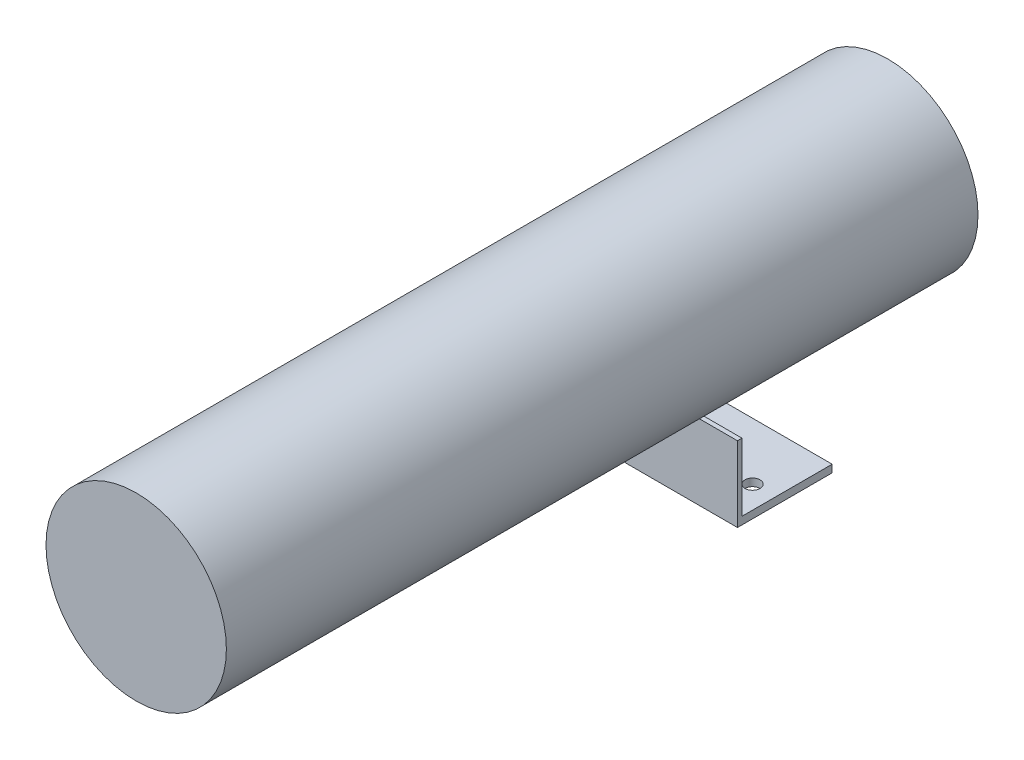
ISO-10303-21;
HEADER;
FILE_DESCRIPTION(('STEP AP214'),'2;1');
FILE_NAME('part.step','',(''),(''),'','','');
FILE_SCHEMA(('AUTOMOTIVE_DESIGN { 1 0 10303 214 1 1 1 1 }'));
ENDSEC;
DATA;
#1=APPLICATION_CONTEXT('core data for automotive mechanical design processes');
#2=APPLICATION_PROTOCOL_DEFINITION('international standard','automotive_design',2000,#1);
#3=PRODUCT_CONTEXT('',#1,'mechanical');
#4=PRODUCT('Part','Part','',(#3));
#5=PRODUCT_RELATED_PRODUCT_CATEGORY('part','',(#4));
#6=PRODUCT_DEFINITION_FORMATION('','',#4);
#7=PRODUCT_DEFINITION_CONTEXT('part definition',#1,'design');
#8=PRODUCT_DEFINITION('design','',#6,#7);
#9=PRODUCT_DEFINITION_SHAPE('','',#8);
#10=(LENGTH_UNIT() NAMED_UNIT(*) SI_UNIT(.MILLI.,.METRE.));
#11=(NAMED_UNIT(*) PLANE_ANGLE_UNIT() SI_UNIT($,.RADIAN.));
#12=(NAMED_UNIT(*) SI_UNIT($,.STERADIAN.) SOLID_ANGLE_UNIT());
#13=UNCERTAINTY_MEASURE_WITH_UNIT(LENGTH_MEASURE(1.E-05),#10,'distance_accuracy_value','');
#14=(GEOMETRIC_REPRESENTATION_CONTEXT(3) GLOBAL_UNCERTAINTY_ASSIGNED_CONTEXT((#13)) GLOBAL_UNIT_ASSIGNED_CONTEXT((#10,
#11,#12)) REPRESENTATION_CONTEXT('',''));
#15=CARTESIAN_POINT('',(0.,0.,0.));
#16=DIRECTION('',(0.,0.,1.));
#17=DIRECTION('',(1.,0.,0.));
#18=AXIS2_PLACEMENT_3D('',#15,#16,#17);
#19=CARTESIAN_POINT('',(63.5,-76.2,186.69));
#20=DIRECTION('',(-1.,0.,0.));
#21=DIRECTION('',(0.,0.,1.));
#22=AXIS2_PLACEMENT_3D('',#19,#20,#21);
#23=PLANE('',#22);
#24=DIRECTION('',(0.,-1.,0.));
#25=VECTOR('',#24,1.);
#26=CARTESIAN_POINT('',(63.5,-76.2,190.5));
#27=LINE('',#26,#25);
#28=CARTESIAN_POINT('',(63.5,-76.2,190.5));
#29=VERTEX_POINT('',#28);
#30=CARTESIAN_POINT('',(63.5,-139.7,190.5));
#31=VERTEX_POINT('',#30);
#32=EDGE_CURVE('E101',#29,#31,#27,.T.);
#33=ORIENTED_EDGE('',*,*,#32,.T.);
#34=DIRECTION('',(0.,0.,1.));
#35=VECTOR('',#34,1.);
#36=CARTESIAN_POINT('',(63.5,-139.7,186.69));
#37=LINE('',#36,#35);
#38=CARTESIAN_POINT('',(63.5,-139.7,110.49));
#39=VERTEX_POINT('',#38);
#40=EDGE_CURVE('E12',#39,#31,#37,.T.);
#41=ORIENTED_EDGE('',*,*,#40,.F.);
#42=DIRECTION('',(0.,-1.,0.));
#43=VECTOR('',#42,1.);
#44=CARTESIAN_POINT('',(63.5,-133.35,110.49));
#45=LINE('',#44,#43);
#46=CARTESIAN_POINT('',(63.5,-133.35,110.49));
#47=VERTEX_POINT('',#46);
#48=EDGE_CURVE('E130',#47,#39,#45,.T.);
#49=ORIENTED_EDGE('',*,*,#48,.F.);
#50=DIRECTION('',(0.,0.,1.));
#51=VECTOR('',#50,1.);
#52=CARTESIAN_POINT('',(63.5,-133.35,110.49));
#53=LINE('',#52,#51);
#54=CARTESIAN_POINT('',(63.5,-133.35,186.69));
#55=VERTEX_POINT('',#54);
#56=EDGE_CURVE('E110',#47,#55,#53,.T.);
#57=ORIENTED_EDGE('',*,*,#56,.T.);
#58=DIRECTION('',(0.,-1.,0.));
#59=VECTOR('',#58,1.);
#60=CARTESIAN_POINT('',(63.5,-76.2,186.69));
#61=LINE('',#60,#59);
#62=CARTESIAN_POINT('',(63.5,-76.2,186.69));
#63=VERTEX_POINT('',#62);
#64=EDGE_CURVE('E95',#63,#55,#61,.T.);
#65=ORIENTED_EDGE('',*,*,#64,.F.);
#66=DIRECTION('',(0.,0.,1.));
#67=VECTOR('',#66,1.);
#68=CARTESIAN_POINT('',(63.5,-76.2,186.69));
#69=LINE('',#68,#67);
#70=EDGE_CURVE('E88',#63,#29,#69,.T.);
#71=ORIENTED_EDGE('',*,*,#70,.T.);
#72=EDGE_LOOP('',(#33,#41,#49,#57,#65,#71));
#73=FACE_BOUND('',#72,.T.);
#74=ADVANCED_FACE('F44',(#73),#23,.F.);
#75=CARTESIAN_POINT('',(63.5,-139.7,186.69));
#76=DIRECTION('',(0.,1.,0.));
#77=DIRECTION('',(0.,0.,1.));
#78=AXIS2_PLACEMENT_3D('',#75,#76,#77);
#79=PLANE('',#78);
#80=CARTESIAN_POINT('',(-44.45,-139.7,158.75));
#81=DIRECTION('',(0.,1.,0.));
#82=DIRECTION('',(0.,0.,1.));
#83=AXIS2_PLACEMENT_3D('',#80,#81,#82);
#84=CIRCLE('',#83,6.35);
#85=CARTESIAN_POINT('',(-44.45,-139.7,165.1));
#86=VERTEX_POINT('',#85);
#87=EDGE_CURVE('E154',#86,#86,#84,.T.);
#88=ORIENTED_EDGE('',*,*,#87,.T.);
#89=EDGE_LOOP('',(#88));
#90=FACE_BOUND('',#89,.T.);
#91=CARTESIAN_POINT('',(44.45,-139.7,158.75));
#92=DIRECTION('',(0.,1.,0.));
#93=DIRECTION('',(0.,0.,1.));
#94=AXIS2_PLACEMENT_3D('',#91,#92,#93);
#95=CIRCLE('',#94,6.35);
#96=CARTESIAN_POINT('',(44.45,-139.7,165.1));
#97=VERTEX_POINT('',#96);
#98=EDGE_CURVE('E131',#97,#97,#95,.T.);
#99=ORIENTED_EDGE('',*,*,#98,.T.);
#100=EDGE_LOOP('',(#99));
#101=FACE_BOUND('',#100,.T.);
#102=DIRECTION('',(-1.,0.,0.));
#103=VECTOR('',#102,1.);
#104=CARTESIAN_POINT('',(63.5,-139.7,190.5));
#105=LINE('',#104,#103);
#106=CARTESIAN_POINT('',(-63.5,-139.7,190.5));
#107=VERTEX_POINT('',#106);
#108=EDGE_CURVE('E105',#31,#107,#105,.T.);
#109=ORIENTED_EDGE('',*,*,#108,.T.);
#110=DIRECTION('',(0.,0.,1.));
#111=VECTOR('',#110,1.);
#112=CARTESIAN_POINT('',(-63.5,-139.7,186.69));
#113=LINE('',#112,#111);
#114=CARTESIAN_POINT('',(-63.5,-139.7,110.49));
#115=VERTEX_POINT('',#114);
#116=EDGE_CURVE('E52',#115,#107,#113,.T.);
#117=ORIENTED_EDGE('',*,*,#116,.F.);
#118=DIRECTION('',(-1.,0.,0.));
#119=VECTOR('',#118,1.);
#120=CARTESIAN_POINT('',(63.5,-139.7,110.49));
#121=LINE('',#120,#119);
#122=EDGE_CURVE('E143',#39,#115,#121,.T.);
#123=ORIENTED_EDGE('',*,*,#122,.F.);
#124=ORIENTED_EDGE('',*,*,#40,.T.);
#125=EDGE_LOOP('',(#109,#117,#123,#124));
#126=FACE_BOUND('',#125,.T.);
#127=ADVANCED_FACE('F163',(#90,#101,#126),#79,.F.);
#128=CARTESIAN_POINT('',(-63.5,-139.7,186.69));
#129=DIRECTION('',(1.,0.,0.));
#130=DIRECTION('',(0.,0.,-1.));
#131=AXIS2_PLACEMENT_3D('',#128,#129,#130);
#132=PLANE('',#131);
#133=DIRECTION('',(0.,1.,0.));
#134=VECTOR('',#133,1.);
#135=CARTESIAN_POINT('',(-63.5,-139.7,190.5));
#136=LINE('',#135,#134);
#137=CARTESIAN_POINT('',(-63.5,-76.2,190.5));
#138=VERTEX_POINT('',#137);
#139=EDGE_CURVE('E96',#107,#138,#136,.T.);
#140=ORIENTED_EDGE('',*,*,#139,.T.);
#141=DIRECTION('',(0.,0.,1.));
#142=VECTOR('',#141,1.);
#143=CARTESIAN_POINT('',(-63.5,-76.2,186.69));
#144=LINE('',#143,#142);
#145=CARTESIAN_POINT('',(-63.5,-76.2,186.69));
#146=VERTEX_POINT('',#145);
#147=EDGE_CURVE('E91',#146,#138,#144,.T.);
#148=ORIENTED_EDGE('',*,*,#147,.F.);
#149=DIRECTION('',(0.,1.,0.));
#150=VECTOR('',#149,1.);
#151=CARTESIAN_POINT('',(-63.5,-139.7,186.69));
#152=LINE('',#151,#150);
#153=CARTESIAN_POINT('',(-63.5,-133.35,186.69));
#154=VERTEX_POINT('',#153);
#155=EDGE_CURVE('E120',#154,#146,#152,.T.);
#156=ORIENTED_EDGE('',*,*,#155,.F.);
#157=DIRECTION('',(0.,0.,1.));
#158=VECTOR('',#157,1.);
#159=CARTESIAN_POINT('',(-63.5,-133.35,110.49));
#160=LINE('',#159,#158);
#161=CARTESIAN_POINT('',(-63.5,-133.35,110.49));
#162=VERTEX_POINT('',#161);
#163=EDGE_CURVE('E106',#162,#154,#160,.T.);
#164=ORIENTED_EDGE('',*,*,#163,.F.);
#165=DIRECTION('',(0.,1.,0.));
#166=VECTOR('',#165,1.);
#167=CARTESIAN_POINT('',(-63.5,-133.35,110.49));
#168=LINE('',#167,#166);
#169=EDGE_CURVE('E138',#115,#162,#168,.T.);
#170=ORIENTED_EDGE('',*,*,#169,.F.);
#171=ORIENTED_EDGE('',*,*,#116,.T.);
#172=EDGE_LOOP('',(#140,#148,#156,#164,#170,#171));
#173=FACE_BOUND('',#172,.T.);
#174=ADVANCED_FACE('F190',(#173),#132,.F.);
#175=CARTESIAN_POINT('',(63.5,-76.2,186.69));
#176=DIRECTION('',(0.,-1.,0.));
#177=DIRECTION('',(0.,0.,-1.));
#178=AXIS2_PLACEMENT_3D('',#175,#176,#177);
#179=PLANE('',#178);
#180=DIRECTION('',(1.,0.,0.));
#181=VECTOR('',#180,1.);
#182=CARTESIAN_POINT('',(63.5,-76.2,190.5));
#183=LINE('',#182,#181);
#184=EDGE_CURVE('E85',#138,#29,#183,.T.);
#185=ORIENTED_EDGE('',*,*,#184,.T.);
#186=ORIENTED_EDGE('',*,*,#70,.F.);
#187=DIRECTION('',(1.,0.,0.));
#188=VECTOR('',#187,1.);
#189=CARTESIAN_POINT('',(63.5,-76.2,186.69));
#190=LINE('',#189,#188);
#191=EDGE_CURVE('E66',#146,#63,#190,.T.);
#192=ORIENTED_EDGE('',*,*,#191,.F.);
#193=ORIENTED_EDGE('',*,*,#147,.T.);
#194=EDGE_LOOP('',(#185,#186,#192,#193));
#195=FACE_BOUND('',#194,.T.);
#196=ADVANCED_FACE('F87',(#195),#179,.F.);
#197=CARTESIAN_POINT('',(0.,0.,186.69));
#198=DIRECTION('',(0.,0.,-1.));
#199=DIRECTION('',(-1.,0.,0.));
#200=AXIS2_PLACEMENT_3D('',#197,#198,#199);
#201=PLANE('',#200);
#202=DIRECTION('',(1.,0.,0.));
#203=VECTOR('',#202,1.);
#204=CARTESIAN_POINT('',(63.5,-133.35,186.69));
#205=LINE('',#204,#203);
#206=EDGE_CURVE('E60',#154,#55,#205,.T.);
#207=ORIENTED_EDGE('',*,*,#206,.F.);
#208=ORIENTED_EDGE('',*,*,#155,.T.);
#209=ORIENTED_EDGE('',*,*,#191,.T.);
#210=ORIENTED_EDGE('',*,*,#64,.T.);
#211=EDGE_LOOP('',(#207,#208,#209,#210));
#212=FACE_BOUND('',#211,.T.);
#213=ADVANCED_FACE('F191',(#212),#201,.T.);
#214=CARTESIAN_POINT('',(0.,0.,190.5));
#215=DIRECTION('',(0.,0.,-1.));
#216=DIRECTION('',(-1.,0.,0.));
#217=AXIS2_PLACEMENT_3D('',#214,#215,#216);
#218=PLANE('',#217);
#219=ORIENTED_EDGE('',*,*,#32,.F.);
#220=ORIENTED_EDGE('',*,*,#184,.F.);
#221=ORIENTED_EDGE('',*,*,#139,.F.);
#222=ORIENTED_EDGE('',*,*,#108,.F.);
#223=EDGE_LOOP('',(#219,#220,#221,#222));
#224=FACE_BOUND('',#223,.T.);
#225=ADVANCED_FACE('F104',(#224),#218,.F.);
#226=CARTESIAN_POINT('',(63.5,-133.35,110.49));
#227=DIRECTION('',(0.,-1.,0.));
#228=DIRECTION('',(0.,0.,-1.));
#229=AXIS2_PLACEMENT_3D('',#226,#227,#228);
#230=PLANE('',#229);
#231=CARTESIAN_POINT('',(-44.45,-133.35,158.75));
#232=DIRECTION('',(0.,1.,0.));
#233=DIRECTION('',(0.,0.,1.));
#234=AXIS2_PLACEMENT_3D('',#231,#232,#233);
#235=CIRCLE('',#234,6.35);
#236=CARTESIAN_POINT('',(-44.45,-133.35,165.1));
#237=VERTEX_POINT('',#236);
#238=EDGE_CURVE('E157',#237,#237,#235,.T.);
#239=ORIENTED_EDGE('',*,*,#238,.F.);
#240=EDGE_LOOP('',(#239));
#241=FACE_BOUND('',#240,.T.);
#242=CARTESIAN_POINT('',(44.45,-133.35,158.75));
#243=DIRECTION('',(0.,1.,0.));
#244=DIRECTION('',(0.,0.,1.));
#245=AXIS2_PLACEMENT_3D('',#242,#243,#244);
#246=CIRCLE('',#245,6.35);
#247=CARTESIAN_POINT('',(44.45,-133.35,165.1));
#248=VERTEX_POINT('',#247);
#249=EDGE_CURVE('E151',#248,#248,#246,.T.);
#250=ORIENTED_EDGE('',*,*,#249,.F.);
#251=EDGE_LOOP('',(#250));
#252=FACE_BOUND('',#251,.T.);
#253=ORIENTED_EDGE('',*,*,#206,.T.);
#254=ORIENTED_EDGE('',*,*,#56,.F.);
#255=DIRECTION('',(1.,0.,0.));
#256=VECTOR('',#255,1.);
#257=CARTESIAN_POINT('',(63.5,-133.35,110.49));
#258=LINE('',#257,#256);
#259=EDGE_CURVE('E127',#162,#47,#258,.T.);
#260=ORIENTED_EDGE('',*,*,#259,.F.);
#261=ORIENTED_EDGE('',*,*,#163,.T.);
#262=EDGE_LOOP('',(#253,#254,#260,#261));
#263=FACE_BOUND('',#262,.T.);
#264=ADVANCED_FACE('F173',(#241,#252,#263),#230,.F.);
#265=CARTESIAN_POINT('',(0.,0.,110.49));
#266=DIRECTION('',(0.,0.,-1.));
#267=DIRECTION('',(-1.,0.,0.));
#268=AXIS2_PLACEMENT_3D('',#265,#266,#267);
#269=PLANE('',#268);
#270=ORIENTED_EDGE('',*,*,#48,.T.);
#271=ORIENTED_EDGE('',*,*,#122,.T.);
#272=ORIENTED_EDGE('',*,*,#169,.T.);
#273=ORIENTED_EDGE('',*,*,#259,.T.);
#274=EDGE_LOOP('',(#270,#271,#272,#273));
#275=FACE_BOUND('',#274,.T.);
#276=ADVANCED_FACE('F176',(#275),#269,.T.);
#277=CARTESIAN_POINT('',(44.45,-139.7,158.75));
#278=DIRECTION('',(0.,1.,0.));
#279=DIRECTION('',(0.,0.,1.));
#280=AXIS2_PLACEMENT_3D('',#277,#278,#279);
#281=CYLINDRICAL_SURFACE('',#280,6.35);
#282=ORIENTED_EDGE('',*,*,#98,.F.);
#283=EDGE_LOOP('',(#282));
#284=FACE_BOUND('',#283,.T.);
#285=ORIENTED_EDGE('',*,*,#249,.T.);
#286=EDGE_LOOP('',(#285));
#287=FACE_BOUND('',#286,.T.);
#288=ADVANCED_FACE('F169',(#284,#287),#281,.F.);
#289=CARTESIAN_POINT('',(-44.45,-139.7,158.75));
#290=DIRECTION('',(0.,1.,0.));
#291=DIRECTION('',(0.,0.,1.));
#292=AXIS2_PLACEMENT_3D('',#289,#290,#291);
#293=CYLINDRICAL_SURFACE('',#292,6.35);
#294=ORIENTED_EDGE('',*,*,#87,.F.);
#295=EDGE_LOOP('',(#294));
#296=FACE_BOUND('',#295,.T.);
#297=ORIENTED_EDGE('',*,*,#238,.T.);
#298=EDGE_LOOP('',(#297));
#299=FACE_BOUND('',#298,.T.);
#300=ADVANCED_FACE('F166',(#296,#299),#293,.F.);
#301=CLOSED_SHELL('',(#74,#127,#174,#196,#213,#225,#264,#276,#288,#300));
#302=MANIFOLD_SOLID_BREP('B2',#301);
#303=CARTESIAN_POINT('',(0.,0.,-25.4));
#304=DIRECTION('',(0.,0.,-1.));
#305=DIRECTION('',(-1.,0.,0.));
#306=AXIS2_PLACEMENT_3D('',#303,#304,#305);
#307=PLANE('',#306);
#308=DIRECTION('',(-0.86215261387927,-0.506648665626529,0.));
#309=VECTOR('',#308,1.);
#310=CARTESIAN_POINT('',(11.3258236549455,-6.42328530210233,-25.4));
#311=LINE('',#310,#309);
#312=CARTESIAN_POINT('',(11.3258236549455,-6.42328530210233,-25.4));
#313=VERTEX_POINT('',#312);
#314=CARTESIAN_POINT('',(0.100183580096926,-13.0200936550167,-25.4));
#315=VERTEX_POINT('',#314);
#316=EDGE_CURVE('E397',#313,#315,#311,.T.);
#317=ORIENTED_EDGE('',*,*,#316,.T.);
#318=DIRECTION('',(-0.869846922165697,0.493321732745339,0.));
#319=VECTOR('',#318,1.);
#320=CARTESIAN_POINT('',(0.100183580096926,-13.0200936550167,-25.4));
#321=LINE('',#320,#319);
#322=CARTESIAN_POINT('',(-11.2256400748486,-6.59680835291437,-25.4));
#323=VERTEX_POINT('',#322);
#324=EDGE_CURVE('E347',#315,#323,#321,.T.);
#325=ORIENTED_EDGE('',*,*,#324,.T.);
#326=DIRECTION('',(-0.00769430828642705,0.999970398371869,0.));
#327=VECTOR('',#326,1.);
#328=CARTESIAN_POINT('',(-11.2256400748486,-6.59680835291437,-25.4));
#329=LINE('',#328,#327);
#330=CARTESIAN_POINT('',(-11.3258236549455,6.42328530210234,-25.4));
#331=VERTEX_POINT('',#330);
#332=EDGE_CURVE('E364',#323,#331,#329,.T.);
#333=ORIENTED_EDGE('',*,*,#332,.T.);
#334=DIRECTION('',(0.86215261387927,0.506648665626529,0.));
#335=VECTOR('',#334,1.);
#336=CARTESIAN_POINT('',(-11.3258236549455,6.42328530210234,-25.4));
#337=LINE('',#336,#335);
#338=CARTESIAN_POINT('',(-0.10018358009693,13.0200936550167,-25.4));
#339=VERTEX_POINT('',#338);
#340=EDGE_CURVE('E357',#331,#339,#337,.T.);
#341=ORIENTED_EDGE('',*,*,#340,.T.);
#342=DIRECTION('',(0.869846922165697,-0.493321732745339,0.));
#343=VECTOR('',#342,1.);
#344=CARTESIAN_POINT('',(-0.10018358009693,13.0200936550167,-25.4));
#345=LINE('',#344,#343);
#346=CARTESIAN_POINT('',(11.2256400748486,6.59680835291438,-25.4));
#347=VERTEX_POINT('',#346);
#348=EDGE_CURVE('E361',#339,#347,#345,.T.);
#349=ORIENTED_EDGE('',*,*,#348,.T.);
#350=DIRECTION('',(0.00769430828642718,-0.999970398371868,0.));
#351=VECTOR('',#350,1.);
#352=CARTESIAN_POINT('',(11.2256400748486,6.59680835291438,-25.4));
#353=LINE('',#352,#351);
#354=EDGE_CURVE('E311',#347,#313,#353,.T.);
#355=ORIENTED_EDGE('',*,*,#354,.T.);
#356=EDGE_LOOP('',(#317,#325,#333,#341,#349,#355));
#357=FACE_BOUND('',#356,.T.);
#358=DIRECTION('',(-0.00769430828642684,0.999970398371869,0.));
#359=VECTOR('',#358,1.);
#360=CARTESIAN_POINT('',(-7.40886845203769,-4.35386178108025,-25.4));
#361=LINE('',#360,#359);
#362=CARTESIAN_POINT('',(-7.40886845203769,-4.35386178108025,-25.4));
#363=VERTEX_POINT('',#362);
#364=CARTESIAN_POINT('',(-7.4749891330005,4.23933740222161,-25.4));
#365=VERTEX_POINT('',#364);
#366=EDGE_CURVE('E499',#363,#365,#361,.T.);
#367=ORIENTED_EDGE('',*,*,#366,.F.);
#368=DIRECTION('',(-0.869846922165697,0.493321732745339,0.));
#369=VECTOR('',#368,1.);
#370=CARTESIAN_POINT('',(0.0661206809628073,-8.59319918330186,-25.4));
#371=LINE('',#370,#369);
#372=CARTESIAN_POINT('',(0.0661206809628073,-8.59319918330186,-25.4));
#373=VERTEX_POINT('',#372);
#374=EDGE_CURVE('E502',#373,#363,#371,.T.);
#375=ORIENTED_EDGE('',*,*,#374,.F.);
#376=DIRECTION('',(-0.86215261387927,-0.506648665626529,0.));
#377=VECTOR('',#376,1.);
#378=CARTESIAN_POINT('',(7.4749891330005,-4.23933740222161,-25.4));
#379=LINE('',#378,#377);
#380=CARTESIAN_POINT('',(7.4749891330005,-4.23933740222161,-25.4));
#381=VERTEX_POINT('',#380);
#382=EDGE_CURVE('E488',#381,#373,#379,.T.);
#383=ORIENTED_EDGE('',*,*,#382,.F.);
#384=DIRECTION('',(0.00769430828642695,-0.999970398371869,0.));
#385=VECTOR('',#384,1.);
#386=CARTESIAN_POINT('',(7.4088684520377,4.35386178108024,-25.4));
#387=LINE('',#386,#385);
#388=CARTESIAN_POINT('',(7.4088684520377,4.35386178108024,-25.4));
#389=VERTEX_POINT('',#388);
#390=EDGE_CURVE('E491',#389,#381,#387,.T.);
#391=ORIENTED_EDGE('',*,*,#390,.F.);
#392=DIRECTION('',(0.869846922165697,-0.493321732745339,0.));
#393=VECTOR('',#392,1.);
#394=CARTESIAN_POINT('',(-0.0661206809628084,8.59319918330185,-25.4));
#395=LINE('',#394,#393);
#396=CARTESIAN_POINT('',(-0.0661206809628084,8.59319918330185,-25.4));
#397=VERTEX_POINT('',#396);
#398=EDGE_CURVE('E493',#397,#389,#395,.T.);
#399=ORIENTED_EDGE('',*,*,#398,.F.);
#400=DIRECTION('',(0.86215261387927,0.506648665626529,0.));
#401=VECTOR('',#400,1.);
#402=CARTESIAN_POINT('',(-7.4749891330005,4.23933740222161,-25.4));
#403=LINE('',#402,#401);
#404=EDGE_CURVE('E496',#365,#397,#403,.T.);
#405=ORIENTED_EDGE('',*,*,#404,.F.);
#406=EDGE_LOOP('',(#367,#375,#383,#391,#399,#405));
#407=FACE_BOUND('',#406,.T.);
#408=ADVANCED_FACE('F287',(#357,#407),#307,.T.);
#409=CARTESIAN_POINT('',(0.,0.,-12.7));
#410=DIRECTION('',(0.,0.,1.));
#411=DIRECTION('',(1.,0.,0.));
#412=AXIS2_PLACEMENT_3D('',#409,#410,#411);
#413=CYLINDRICAL_SURFACE('',#412,12.7);
#414=CARTESIAN_POINT('',(0.,0.,-12.7));
#415=DIRECTION('',(0.,0.,-1.));
#416=DIRECTION('',(-1.,0.,0.));
#417=AXIS2_PLACEMENT_3D('',#414,#415,#416);
#418=CIRCLE('',#417,12.7);
#419=CARTESIAN_POINT('',(-12.7,0.,-12.7));
#420=VERTEX_POINT('',#419);
#421=EDGE_CURVE('E42',#420,#420,#418,.T.);
#422=ORIENTED_EDGE('',*,*,#421,.F.);
#423=EDGE_LOOP('',(#422));
#424=FACE_BOUND('',#423,.T.);
#425=CARTESIAN_POINT('',(0.,0.,0.));
#426=DIRECTION('',(0.,0.,-1.));
#427=DIRECTION('',(-1.,0.,0.));
#428=AXIS2_PLACEMENT_3D('',#425,#426,#427);
#429=CIRCLE('',#428,12.7);
#430=CARTESIAN_POINT('',(-12.7,0.,0.));
#431=VERTEX_POINT('',#430);
#432=EDGE_CURVE('E291',#431,#431,#429,.T.);
#433=ORIENTED_EDGE('',*,*,#432,.T.);
#434=EDGE_LOOP('',(#433));
#435=FACE_BOUND('',#434,.T.);
#436=ADVANCED_FACE('F289',(#424,#435),#413,.T.);
#437=CARTESIAN_POINT('',(0.,0.,-12.7));
#438=DIRECTION('',(0.,0.,-1.));
#439=DIRECTION('',(-1.,0.,0.));
#440=AXIS2_PLACEMENT_3D('',#437,#438,#439);
#441=PLANE('',#440);
#442=CARTESIAN_POINT('',(0.,0.,-12.7));
#443=DIRECTION('',(0.,0.,-1.));
#444=DIRECTION('',(0.,1.,0.));
#445=AXIS2_PLACEMENT_3D('',#442,#443,#444);
#446=CIRCLE('',#445,7.62);
#447=CARTESIAN_POINT('',(0.,7.62,-12.7));
#448=VERTEX_POINT('',#447);
#449=EDGE_CURVE('E406',#448,#448,#446,.T.);
#450=ORIENTED_EDGE('',*,*,#449,.F.);
#451=EDGE_LOOP('',(#450));
#452=FACE_BOUND('',#451,.T.);
#453=ORIENTED_EDGE('',*,*,#421,.T.);
#454=EDGE_LOOP('',(#453));
#455=FACE_BOUND('',#454,.T.);
#456=ADVANCED_FACE('F415',(#452,#455),#441,.T.);
#457=CARTESIAN_POINT('',(0.,0.,0.));
#458=DIRECTION('',(0.,0.,-1.));
#459=DIRECTION('',(-1.,0.,0.));
#460=AXIS2_PLACEMENT_3D('',#457,#458,#459);
#461=PLANE('',#460);
#462=ORIENTED_EDGE('',*,*,#432,.F.);
#463=EDGE_LOOP('',(#462));
#464=FACE_BOUND('',#463,.T.);
#465=ADVANCED_FACE('F418',(#464),#461,.F.);
#466=CARTESIAN_POINT('',(0.,0.,-17.78));
#467=DIRECTION('',(0.,0.,1.));
#468=DIRECTION('',(0.,-1.,0.));
#469=AXIS2_PLACEMENT_3D('',#466,#467,#468);
#470=CYLINDRICAL_SURFACE('',#469,7.62);
#471=CARTESIAN_POINT('',(0.,0.,-17.78));
#472=DIRECTION('',(0.,0.,-1.));
#473=DIRECTION('',(0.,1.,0.));
#474=AXIS2_PLACEMENT_3D('',#471,#472,#473);
#475=CIRCLE('',#474,7.62);
#476=CARTESIAN_POINT('',(0.,7.62,-17.78));
#477=VERTEX_POINT('',#476);
#478=EDGE_CURVE('E407',#477,#477,#475,.T.);
#479=ORIENTED_EDGE('',*,*,#478,.F.);
#480=EDGE_LOOP('',(#479));
#481=FACE_BOUND('',#480,.T.);
#482=ORIENTED_EDGE('',*,*,#449,.T.);
#483=EDGE_LOOP('',(#482));
#484=FACE_BOUND('',#483,.T.);
#485=ADVANCED_FACE('F413',(#481,#484),#470,.T.);
#486=CARTESIAN_POINT('',(11.3258236549455,-6.42328530210233,-25.4));
#487=DIRECTION('',(-0.506648665626529,0.86215261387927,0.));
#488=DIRECTION('',(-0.86215261387927,-0.506648665626529,0.));
#489=AXIS2_PLACEMENT_3D('',#486,#487,#488);
#490=PLANE('',#489);
#491=DIRECTION('',(-0.86215261387927,-0.506648665626529,0.));
#492=VECTOR('',#491,1.);
#493=CARTESIAN_POINT('',(11.3258236549455,-6.42328530210233,-17.78));
#494=LINE('',#493,#492);
#495=CARTESIAN_POINT('',(11.3258236549455,-6.42328530210233,-17.78));
#496=VERTEX_POINT('',#495);
#497=CARTESIAN_POINT('',(0.100183580096926,-13.0200936550167,-17.78));
#498=VERTEX_POINT('',#497);
#499=EDGE_CURVE('E385',#496,#498,#494,.T.);
#500=ORIENTED_EDGE('',*,*,#499,.T.);
#501=DIRECTION('',(0.,0.,1.));
#502=VECTOR('',#501,1.);
#503=CARTESIAN_POINT('',(0.100183580096926,-13.0200936550167,-25.4));
#504=LINE('',#503,#502);
#505=EDGE_CURVE('E404',#315,#498,#504,.T.);
#506=ORIENTED_EDGE('',*,*,#505,.F.);
#507=ORIENTED_EDGE('',*,*,#316,.F.);
#508=DIRECTION('',(0.,0.,1.));
#509=VECTOR('',#508,1.);
#510=CARTESIAN_POINT('',(11.3258236549455,-6.42328530210233,-25.4));
#511=LINE('',#510,#509);
#512=EDGE_CURVE('E381',#313,#496,#511,.T.);
#513=ORIENTED_EDGE('',*,*,#512,.T.);
#514=EDGE_LOOP('',(#500,#506,#507,#513));
#515=FACE_BOUND('',#514,.T.);
#516=ADVANCED_FACE('F431',(#515),#490,.F.);
#517=CARTESIAN_POINT('',(0.100183580096926,-13.0200936550167,-25.4));
#518=DIRECTION('',(0.49332173274534,0.869846922165697,0.));
#519=DIRECTION('',(-0.869846922165697,0.49332173274534,0.));
#520=AXIS2_PLACEMENT_3D('',#517,#518,#519);
#521=PLANE('',#520);
#522=DIRECTION('',(-0.869846922165697,0.493321732745339,0.));
#523=VECTOR('',#522,1.);
#524=CARTESIAN_POINT('',(0.100183580096926,-13.0200936550167,-17.78));
#525=LINE('',#524,#523);
#526=CARTESIAN_POINT('',(-11.2256400748486,-6.59680835291437,-17.78));
#527=VERTEX_POINT('',#526);
#528=EDGE_CURVE('E388',#498,#527,#525,.T.);
#529=ORIENTED_EDGE('',*,*,#528,.T.);
#530=DIRECTION('',(0.,0.,1.));
#531=VECTOR('',#530,1.);
#532=CARTESIAN_POINT('',(-11.2256400748486,-6.59680835291437,-25.4));
#533=LINE('',#532,#531);
#534=EDGE_CURVE('E401',#323,#527,#533,.T.);
#535=ORIENTED_EDGE('',*,*,#534,.F.);
#536=ORIENTED_EDGE('',*,*,#324,.F.);
#537=ORIENTED_EDGE('',*,*,#505,.T.);
#538=EDGE_LOOP('',(#529,#535,#536,#537));
#539=FACE_BOUND('',#538,.T.);
#540=ADVANCED_FACE('F456',(#539),#521,.F.);
#541=CARTESIAN_POINT('',(-11.2256400748486,-6.59680835291437,-25.4));
#542=DIRECTION('',(0.999970398371869,0.00769430828642705,0.));
#543=DIRECTION('',(-0.00769430828642705,0.999970398371869,0.));
#544=AXIS2_PLACEMENT_3D('',#541,#542,#543);
#545=PLANE('',#544);
#546=DIRECTION('',(-0.00769430828642705,0.999970398371869,0.));
#547=VECTOR('',#546,1.);
#548=CARTESIAN_POINT('',(-11.2256400748486,-6.59680835291437,-17.78));
#549=LINE('',#548,#547);
#550=CARTESIAN_POINT('',(-11.3258236549455,6.42328530210234,-17.78));
#551=VERTEX_POINT('',#550);
#552=EDGE_CURVE('E391',#527,#551,#549,.T.);
#553=ORIENTED_EDGE('',*,*,#552,.T.);
#554=DIRECTION('',(0.,0.,1.));
#555=VECTOR('',#554,1.);
#556=CARTESIAN_POINT('',(-11.3258236549455,6.42328530210234,-25.4));
#557=LINE('',#556,#555);
#558=EDGE_CURVE('E376',#331,#551,#557,.T.);
#559=ORIENTED_EDGE('',*,*,#558,.F.);
#560=ORIENTED_EDGE('',*,*,#332,.F.);
#561=ORIENTED_EDGE('',*,*,#534,.T.);
#562=EDGE_LOOP('',(#553,#559,#560,#561));
#563=FACE_BOUND('',#562,.T.);
#564=ADVANCED_FACE('F453',(#563),#545,.F.);
#565=CARTESIAN_POINT('',(-11.3258236549455,6.42328530210234,-25.4));
#566=DIRECTION('',(0.506648665626529,-0.86215261387927,0.));
#567=DIRECTION('',(0.86215261387927,0.506648665626529,0.));
#568=AXIS2_PLACEMENT_3D('',#565,#566,#567);
#569=PLANE('',#568);
#570=DIRECTION('',(0.86215261387927,0.506648665626529,0.));
#571=VECTOR('',#570,1.);
#572=CARTESIAN_POINT('',(-11.3258236549455,6.42328530210234,-17.78));
#573=LINE('',#572,#571);
#574=CARTESIAN_POINT('',(-0.10018358009693,13.0200936550167,-17.78));
#575=VERTEX_POINT('',#574);
#576=EDGE_CURVE('E373',#551,#575,#573,.T.);
#577=ORIENTED_EDGE('',*,*,#576,.T.);
#578=DIRECTION('',(0.,0.,1.));
#579=VECTOR('',#578,1.);
#580=CARTESIAN_POINT('',(-0.10018358009693,13.0200936550167,-25.4));
#581=LINE('',#580,#579);
#582=EDGE_CURVE('E370',#339,#575,#581,.T.);
#583=ORIENTED_EDGE('',*,*,#582,.F.);
#584=ORIENTED_EDGE('',*,*,#340,.F.);
#585=ORIENTED_EDGE('',*,*,#558,.T.);
#586=EDGE_LOOP('',(#577,#583,#584,#585));
#587=FACE_BOUND('',#586,.T.);
#588=ADVANCED_FACE('F371',(#587),#569,.F.);
#589=CARTESIAN_POINT('',(-0.10018358009693,13.0200936550167,-25.4));
#590=DIRECTION('',(-0.49332173274534,-0.869846922165697,0.));
#591=DIRECTION('',(0.869846922165697,-0.49332173274534,0.));
#592=AXIS2_PLACEMENT_3D('',#589,#590,#591);
#593=PLANE('',#592);
#594=DIRECTION('',(0.869846922165697,-0.493321732745339,0.));
#595=VECTOR('',#594,1.);
#596=CARTESIAN_POINT('',(-0.10018358009693,13.0200936550167,-17.78));
#597=LINE('',#596,#595);
#598=CARTESIAN_POINT('',(11.2256400748486,6.59680835291437,-17.78));
#599=VERTEX_POINT('',#598);
#600=EDGE_CURVE('E394',#575,#599,#597,.T.);
#601=ORIENTED_EDGE('',*,*,#600,.T.);
#602=DIRECTION('',(0.,0.,1.));
#603=VECTOR('',#602,1.);
#604=CARTESIAN_POINT('',(11.2256400748486,6.59680835291438,-25.4));
#605=LINE('',#604,#603);
#606=EDGE_CURVE('E377',#347,#599,#605,.T.);
#607=ORIENTED_EDGE('',*,*,#606,.F.);
#608=ORIENTED_EDGE('',*,*,#348,.F.);
#609=ORIENTED_EDGE('',*,*,#582,.T.);
#610=EDGE_LOOP('',(#601,#607,#608,#609));
#611=FACE_BOUND('',#610,.T.);
#612=ADVANCED_FACE('F379',(#611),#593,.F.);
#613=CARTESIAN_POINT('',(11.2256400748486,6.59680835291438,-25.4));
#614=DIRECTION('',(-0.999970398371869,-0.00769430828642719,0.));
#615=DIRECTION('',(0.00769430828642719,-0.999970398371869,0.));
#616=AXIS2_PLACEMENT_3D('',#613,#614,#615);
#617=PLANE('',#616);
#618=DIRECTION('',(0.00769430828642718,-0.999970398371868,0.));
#619=VECTOR('',#618,1.);
#620=CARTESIAN_POINT('',(11.2256400748486,6.59680835291437,-17.78));
#621=LINE('',#620,#619);
#622=EDGE_CURVE('E338',#599,#496,#621,.T.);
#623=ORIENTED_EDGE('',*,*,#622,.T.);
#624=ORIENTED_EDGE('',*,*,#512,.F.);
#625=ORIENTED_EDGE('',*,*,#354,.F.);
#626=ORIENTED_EDGE('',*,*,#606,.T.);
#627=EDGE_LOOP('',(#623,#624,#625,#626));
#628=FACE_BOUND('',#627,.T.);
#629=ADVANCED_FACE('F445',(#628),#617,.F.);
#630=CARTESIAN_POINT('',(0.,0.,-17.78));
#631=DIRECTION('',(0.,0.,-1.));
#632=DIRECTION('',(-1.,0.,0.));
#633=AXIS2_PLACEMENT_3D('',#630,#631,#632);
#634=PLANE('',#633);
#635=ORIENTED_EDGE('',*,*,#478,.T.);
#636=EDGE_LOOP('',(#635));
#637=FACE_BOUND('',#636,.T.);
#638=ORIENTED_EDGE('',*,*,#499,.F.);
#639=ORIENTED_EDGE('',*,*,#622,.F.);
#640=ORIENTED_EDGE('',*,*,#600,.F.);
#641=ORIENTED_EDGE('',*,*,#576,.F.);
#642=ORIENTED_EDGE('',*,*,#552,.F.);
#643=ORIENTED_EDGE('',*,*,#528,.F.);
#644=EDGE_LOOP('',(#638,#639,#640,#641,#642,#643));
#645=FACE_BOUND('',#644,.T.);
#646=ADVANCED_FACE('F442',(#637,#645),#634,.F.);
#647=CARTESIAN_POINT('',(0.0661206809628073,-8.59319918330186,-27.94));
#648=DIRECTION('',(0.493321732745339,0.869846922165697,0.));
#649=DIRECTION('',(-0.869846922165697,0.493321732745339,0.));
#650=AXIS2_PLACEMENT_3D('',#647,#648,#649);
#651=PLANE('',#650);
#652=ORIENTED_EDGE('',*,*,#374,.T.);
#653=DIRECTION('',(0.,0.,1.));
#654=VECTOR('',#653,1.);
#655=CARTESIAN_POINT('',(-7.40886845203769,-4.35386178108025,-27.94));
#656=LINE('',#655,#654);
#657=CARTESIAN_POINT('',(-7.40886845203769,-4.35386178108025,-27.94));
#658=VERTEX_POINT('',#657);
#659=EDGE_CURVE('E389',#658,#363,#656,.T.);
#660=ORIENTED_EDGE('',*,*,#659,.F.);
#661=DIRECTION('',(-0.869846922165697,0.493321732745339,0.));
#662=VECTOR('',#661,1.);
#663=CARTESIAN_POINT('',(0.0661206809628073,-8.59319918330186,-27.94));
#664=LINE('',#663,#662);
#665=CARTESIAN_POINT('',(0.0661206809628073,-8.59319918330186,-27.94));
#666=VERTEX_POINT('',#665);
#667=EDGE_CURVE('E490',#666,#658,#664,.T.);
#668=ORIENTED_EDGE('',*,*,#667,.F.);
#669=DIRECTION('',(0.,0.,1.));
#670=VECTOR('',#669,1.);
#671=CARTESIAN_POINT('',(0.0661206809628073,-8.59319918330186,-27.94));
#672=LINE('',#671,#670);
#673=EDGE_CURVE('E484',#666,#373,#672,.T.);
#674=ORIENTED_EDGE('',*,*,#673,.T.);
#675=EDGE_LOOP('',(#652,#660,#668,#674));
#676=FACE_BOUND('',#675,.T.);
#677=ADVANCED_FACE('F440',(#676),#651,.F.);
#678=CARTESIAN_POINT('',(-7.40886845203769,-4.35386178108025,-27.94));
#679=DIRECTION('',(0.999970398371869,0.00769430828642684,0.));
#680=DIRECTION('',(-0.00769430828642684,0.999970398371869,0.));
#681=AXIS2_PLACEMENT_3D('',#678,#679,#680);
#682=PLANE('',#681);
#683=ORIENTED_EDGE('',*,*,#366,.T.);
#684=DIRECTION('',(0.,0.,1.));
#685=VECTOR('',#684,1.);
#686=CARTESIAN_POINT('',(-7.4749891330005,4.23933740222161,-27.94));
#687=LINE('',#686,#685);
#688=CARTESIAN_POINT('',(-7.4749891330005,4.23933740222161,-27.94));
#689=VERTEX_POINT('',#688);
#690=EDGE_CURVE('E474',#689,#365,#687,.T.);
#691=ORIENTED_EDGE('',*,*,#690,.F.);
#692=DIRECTION('',(-0.00769430828642684,0.999970398371869,0.));
#693=VECTOR('',#692,1.);
#694=CARTESIAN_POINT('',(-7.40886845203769,-4.35386178108025,-27.94));
#695=LINE('',#694,#693);
#696=EDGE_CURVE('E517',#658,#689,#695,.T.);
#697=ORIENTED_EDGE('',*,*,#696,.F.);
#698=ORIENTED_EDGE('',*,*,#659,.T.);
#699=EDGE_LOOP('',(#683,#691,#697,#698));
#700=FACE_BOUND('',#699,.T.);
#701=ADVANCED_FACE('F554',(#700),#682,.F.);
#702=CARTESIAN_POINT('',(-7.4749891330005,4.23933740222161,-27.94));
#703=DIRECTION('',(0.506648665626529,-0.86215261387927,0.));
#704=DIRECTION('',(0.86215261387927,0.506648665626529,0.));
#705=AXIS2_PLACEMENT_3D('',#702,#703,#704);
#706=PLANE('',#705);
#707=ORIENTED_EDGE('',*,*,#404,.T.);
#708=DIRECTION('',(0.,0.,1.));
#709=VECTOR('',#708,1.);
#710=CARTESIAN_POINT('',(-0.0661206809628084,8.59319918330185,-27.94));
#711=LINE('',#710,#709);
#712=CARTESIAN_POINT('',(-0.0661206809628084,8.59319918330185,-27.94));
#713=VERTEX_POINT('',#712);
#714=EDGE_CURVE('E477',#713,#397,#711,.T.);
#715=ORIENTED_EDGE('',*,*,#714,.F.);
#716=DIRECTION('',(0.86215261387927,0.506648665626529,0.));
#717=VECTOR('',#716,1.);
#718=CARTESIAN_POINT('',(-7.4749891330005,4.23933740222161,-27.94));
#719=LINE('',#718,#717);
#720=EDGE_CURVE('E514',#689,#713,#719,.T.);
#721=ORIENTED_EDGE('',*,*,#720,.F.);
#722=ORIENTED_EDGE('',*,*,#690,.T.);
#723=EDGE_LOOP('',(#707,#715,#721,#722));
#724=FACE_BOUND('',#723,.T.);
#725=ADVANCED_FACE('F571',(#724),#706,.F.);
#726=CARTESIAN_POINT('',(-0.0661206809628084,8.59319918330185,-27.94));
#727=DIRECTION('',(-0.493321732745339,-0.869846922165697,0.));
#728=DIRECTION('',(0.869846922165697,-0.493321732745339,0.));
#729=AXIS2_PLACEMENT_3D('',#726,#727,#728);
#730=PLANE('',#729);
#731=ORIENTED_EDGE('',*,*,#398,.T.);
#732=DIRECTION('',(0.,0.,1.));
#733=VECTOR('',#732,1.);
#734=CARTESIAN_POINT('',(7.4088684520377,4.35386178108024,-27.94));
#735=LINE('',#734,#733);
#736=CARTESIAN_POINT('',(7.4088684520377,4.35386178108024,-27.94));
#737=VERTEX_POINT('',#736);
#738=EDGE_CURVE('E480',#737,#389,#735,.T.);
#739=ORIENTED_EDGE('',*,*,#738,.F.);
#740=DIRECTION('',(0.869846922165697,-0.493321732745339,0.));
#741=VECTOR('',#740,1.);
#742=CARTESIAN_POINT('',(-0.0661206809628084,8.59319918330185,-27.94));
#743=LINE('',#742,#741);
#744=EDGE_CURVE('E511',#713,#737,#743,.T.);
#745=ORIENTED_EDGE('',*,*,#744,.F.);
#746=ORIENTED_EDGE('',*,*,#714,.T.);
#747=EDGE_LOOP('',(#731,#739,#745,#746));
#748=FACE_BOUND('',#747,.T.);
#749=ADVANCED_FACE('F575',(#748),#730,.F.);
#750=CARTESIAN_POINT('',(7.4088684520377,4.35386178108024,-27.94));
#751=DIRECTION('',(-0.999970398371869,-0.00769430828642695,0.));
#752=DIRECTION('',(0.00769430828642695,-0.999970398371869,0.));
#753=AXIS2_PLACEMENT_3D('',#750,#751,#752);
#754=PLANE('',#753);
#755=ORIENTED_EDGE('',*,*,#390,.T.);
#756=DIRECTION('',(0.,0.,1.));
#757=VECTOR('',#756,1.);
#758=CARTESIAN_POINT('',(7.4749891330005,-4.23933740222161,-27.94));
#759=LINE('',#758,#757);
#760=CARTESIAN_POINT('',(7.4749891330005,-4.23933740222161,-27.94));
#761=VERTEX_POINT('',#760);
#762=EDGE_CURVE('E302',#761,#381,#759,.T.);
#763=ORIENTED_EDGE('',*,*,#762,.F.);
#764=DIRECTION('',(0.00769430828642695,-0.999970398371869,0.));
#765=VECTOR('',#764,1.);
#766=CARTESIAN_POINT('',(7.4088684520377,4.35386178108024,-27.94));
#767=LINE('',#766,#765);
#768=EDGE_CURVE('E508',#737,#761,#767,.T.);
#769=ORIENTED_EDGE('',*,*,#768,.F.);
#770=ORIENTED_EDGE('',*,*,#738,.T.);
#771=EDGE_LOOP('',(#755,#763,#769,#770));
#772=FACE_BOUND('',#771,.T.);
#773=ADVANCED_FACE('F583',(#772),#754,.F.);
#774=CARTESIAN_POINT('',(7.4749891330005,-4.23933740222161,-27.94));
#775=DIRECTION('',(-0.506648665626529,0.86215261387927,0.));
#776=DIRECTION('',(-0.86215261387927,-0.506648665626529,0.));
#777=AXIS2_PLACEMENT_3D('',#774,#775,#776);
#778=PLANE('',#777);
#779=ORIENTED_EDGE('',*,*,#382,.T.);
#780=ORIENTED_EDGE('',*,*,#673,.F.);
#781=DIRECTION('',(-0.86215261387927,-0.506648665626529,0.));
#782=VECTOR('',#781,1.);
#783=CARTESIAN_POINT('',(7.4749891330005,-4.23933740222161,-27.94));
#784=LINE('',#783,#782);
#785=EDGE_CURVE('E487',#761,#666,#784,.T.);
#786=ORIENTED_EDGE('',*,*,#785,.F.);
#787=ORIENTED_EDGE('',*,*,#762,.T.);
#788=EDGE_LOOP('',(#779,#780,#786,#787));
#789=FACE_BOUND('',#788,.T.);
#790=ADVANCED_FACE('F539',(#789),#778,.F.);
#791=CARTESIAN_POINT('',(0.,0.,-27.94));
#792=DIRECTION('',(0.,0.,-1.));
#793=DIRECTION('',(-1.,0.,0.));
#794=AXIS2_PLACEMENT_3D('',#791,#792,#793);
#795=PLANE('',#794);
#796=CARTESIAN_POINT('',(0.,0.,-27.94));
#797=DIRECTION('',(0.,0.,-1.));
#798=DIRECTION('',(0.,1.,0.));
#799=AXIS2_PLACEMENT_3D('',#796,#797,#798);
#800=CIRCLE('',#799,5.08);
#801=CARTESIAN_POINT('',(0.,5.08,-27.94));
#802=VERTEX_POINT('',#801);
#803=EDGE_CURVE('E522',#802,#802,#800,.T.);
#804=ORIENTED_EDGE('',*,*,#803,.F.);
#805=EDGE_LOOP('',(#804));
#806=FACE_BOUND('',#805,.T.);
#807=ORIENTED_EDGE('',*,*,#667,.T.);
#808=ORIENTED_EDGE('',*,*,#696,.T.);
#809=ORIENTED_EDGE('',*,*,#720,.T.);
#810=ORIENTED_EDGE('',*,*,#744,.T.);
#811=ORIENTED_EDGE('',*,*,#768,.T.);
#812=ORIENTED_EDGE('',*,*,#785,.T.);
#813=EDGE_LOOP('',(#807,#808,#809,#810,#811,#812));
#814=FACE_BOUND('',#813,.T.);
#815=ADVANCED_FACE('F533',(#806,#814),#795,.T.);
#816=CARTESIAN_POINT('',(0.,0.,-33.02));
#817=DIRECTION('',(0.,0.,1.));
#818=DIRECTION('',(0.,-1.,0.));
#819=AXIS2_PLACEMENT_3D('',#816,#817,#818);
#820=CYLINDRICAL_SURFACE('',#819,5.08);
#821=CARTESIAN_POINT('',(0.,0.,-33.02));
#822=DIRECTION('',(0.,0.,-1.));
#823=DIRECTION('',(0.,1.,0.));
#824=AXIS2_PLACEMENT_3D('',#821,#822,#823);
#825=CIRCLE('',#824,5.08);
#826=CARTESIAN_POINT('',(0.,5.08,-33.02));
#827=VERTEX_POINT('',#826);
#828=EDGE_CURVE('E505',#827,#827,#825,.T.);
#829=ORIENTED_EDGE('',*,*,#828,.F.);
#830=EDGE_LOOP('',(#829));
#831=FACE_BOUND('',#830,.T.);
#832=ORIENTED_EDGE('',*,*,#803,.T.);
#833=EDGE_LOOP('',(#832));
#834=FACE_BOUND('',#833,.T.);
#835=ADVANCED_FACE('F530',(#831,#834),#820,.T.);
#836=CARTESIAN_POINT('',(0.,0.,-33.02));
#837=DIRECTION('',(0.,0.,-1.));
#838=DIRECTION('',(0.,1.,0.));
#839=AXIS2_PLACEMENT_3D('',#836,#837,#838);
#840=PLANE('',#839);
#841=ORIENTED_EDGE('',*,*,#828,.T.);
#842=EDGE_LOOP('',(#841));
#843=FACE_BOUND('',#842,.T.);
#844=ADVANCED_FACE('F528',(#843),#840,.T.);
#845=CLOSED_SHELL('',(#408,#436,#456,#465,#485,#516,#540,#564,#588,#612,#629,#646,#677,#701,
#725,#749,#773,#790,#815,#835,#844));
#846=MANIFOLD_SOLID_BREP('B6',#845);
#847=CARTESIAN_POINT('',(0.,0.,635.));
#848=DIRECTION('',(0.,0.,-1.));
#849=DIRECTION('',(-1.,0.,0.));
#850=AXIS2_PLACEMENT_3D('',#847,#848,#849);
#851=CYLINDRICAL_SURFACE('',#850,76.2);
#852=CARTESIAN_POINT('',(0.,0.,635.));
#853=DIRECTION('',(0.,0.,1.));
#854=DIRECTION('',(1.,0.,0.));
#855=AXIS2_PLACEMENT_3D('',#852,#853,#854);
#856=CIRCLE('',#855,76.2);
#857=CARTESIAN_POINT('',(-76.2,0.,635.));
#858=VERTEX_POINT('',#857);
#859=EDGE_CURVE('E286',#858,#858,#856,.T.);
#860=CARTESIAN_POINT('',(0.,0.,0.));
#861=DIRECTION('',(0.,0.,1.));
#862=DIRECTION('',(1.,0.,0.));
#863=AXIS2_PLACEMENT_3D('',#860,#861,#862);
#864=CIRCLE('',#863,76.2);
#865=CARTESIAN_POINT('',(-76.2,0.,-1.11022302462516E-13));
#866=VERTEX_POINT('',#865);
#867=EDGE_CURVE('E723',#866,#866,#864,.T.);
#868=CARTESIAN_POINT('',(-76.2,0.,635.));
#869=CARTESIAN_POINT('',(-76.2,0.,628.385416666667));
#870=CARTESIAN_POINT('',(-76.2,0.,621.770833333333));
#871=CARTESIAN_POINT('',(-76.2,0.,608.541666666667));
#872=CARTESIAN_POINT('',(-76.2,0.,601.927083333333));
#873=CARTESIAN_POINT('',(-76.2,0.,588.697916666667));
#874=CARTESIAN_POINT('',(-76.2,0.,582.083333333333));
#875=CARTESIAN_POINT('',(-76.2,0.,568.854166666667));
#876=CARTESIAN_POINT('',(-76.2,0.,562.239583333333));
#877=CARTESIAN_POINT('',(-76.2,0.,549.010416666667));
#878=CARTESIAN_POINT('',(-76.2,0.,542.395833333333));
#879=CARTESIAN_POINT('',(-76.2,0.,529.166666666667));
#880=CARTESIAN_POINT('',(-76.2,0.,522.552083333333));
#881=CARTESIAN_POINT('',(-76.2,0.,509.322916666667));
#882=CARTESIAN_POINT('',(-76.2,0.,502.708333333333));
#883=CARTESIAN_POINT('',(-76.2,0.,489.479166666667));
#884=CARTESIAN_POINT('',(-76.2,0.,482.864583333333));
#885=CARTESIAN_POINT('',(-76.2,0.,469.635416666667));
#886=CARTESIAN_POINT('',(-76.2,0.,463.020833333333));
#887=CARTESIAN_POINT('',(-76.2,0.,449.791666666667));
#888=CARTESIAN_POINT('',(-76.2,0.,443.177083333333));
#889=CARTESIAN_POINT('',(-76.2,0.,429.947916666667));
#890=CARTESIAN_POINT('',(-76.2,0.,423.333333333333));
#891=CARTESIAN_POINT('',(-76.2,0.,410.104166666667));
#892=CARTESIAN_POINT('',(-76.2,0.,403.489583333333));
#893=CARTESIAN_POINT('',(-76.2,0.,390.260416666667));
#894=CARTESIAN_POINT('',(-76.2,0.,383.645833333333));
#895=CARTESIAN_POINT('',(-76.2,0.,370.416666666667));
#896=CARTESIAN_POINT('',(-76.2,0.,363.802083333333));
#897=CARTESIAN_POINT('',(-76.2,0.,350.572916666667));
#898=CARTESIAN_POINT('',(-76.2,0.,343.958333333333));
#899=CARTESIAN_POINT('',(-76.2,0.,330.729166666667));
#900=CARTESIAN_POINT('',(-76.2,0.,324.114583333333));
#901=CARTESIAN_POINT('',(-76.2,0.,310.885416666667));
#902=CARTESIAN_POINT('',(-76.2,0.,304.270833333333));
#903=CARTESIAN_POINT('',(-76.2,0.,291.041666666667));
#904=CARTESIAN_POINT('',(-76.2,0.,284.427083333333));
#905=CARTESIAN_POINT('',(-76.2,0.,271.197916666667));
#906=CARTESIAN_POINT('',(-76.2,0.,264.583333333333));
#907=CARTESIAN_POINT('',(-76.2,0.,251.354166666667));
#908=CARTESIAN_POINT('',(-76.2,0.,244.739583333333));
#909=CARTESIAN_POINT('',(-76.2,0.,231.510416666667));
#910=CARTESIAN_POINT('',(-76.2,0.,224.895833333333));
#911=CARTESIAN_POINT('',(-76.2,0.,211.666666666667));
#912=CARTESIAN_POINT('',(-76.2,0.,205.052083333333));
#913=CARTESIAN_POINT('',(-76.2,0.,191.822916666666));
#914=CARTESIAN_POINT('',(-76.2,0.,185.208333333333));
#915=CARTESIAN_POINT('',(-76.2,0.,171.979166666666));
#916=CARTESIAN_POINT('',(-76.2,0.,165.364583333333));
#917=CARTESIAN_POINT('',(-76.2,0.,152.135416666666));
#918=CARTESIAN_POINT('',(-76.2,0.,145.520833333333));
#919=CARTESIAN_POINT('',(-76.2,0.,132.291666666667));
#920=CARTESIAN_POINT('',(-76.2,0.,125.677083333333));
#921=CARTESIAN_POINT('',(-76.2,0.,112.447916666667));
#922=CARTESIAN_POINT('',(-76.2,0.,105.833333333333));
#923=CARTESIAN_POINT('',(-76.2,0.,92.6041666666666));
#924=CARTESIAN_POINT('',(-76.2,0.,85.9895833333332));
#925=CARTESIAN_POINT('',(-76.2,0.,72.7604166666665));
#926=CARTESIAN_POINT('',(-76.2,0.,66.1458333333332));
#927=CARTESIAN_POINT('',(-76.2,0.,52.9166666666666));
#928=CARTESIAN_POINT('',(-76.2,0.,46.3020833333332));
#929=CARTESIAN_POINT('',(-76.2,0.,33.0729166666666));
#930=CARTESIAN_POINT('',(-76.2,0.,26.4583333333333));
#931=CARTESIAN_POINT('',(-76.2,0.,13.2291666666666));
#932=CARTESIAN_POINT('',(-76.2,0.,6.61458333333324));
#933=CARTESIAN_POINT('',(-76.2,0.,-1.11022302462516E-13));
#934=B_SPLINE_CURVE_WITH_KNOTS('',3,(#868,#869,#870,#871,#872,#873,#874,#875,#876,#877,#878,
#879,#880,#881,#882,#883,#884,#885,#886,#887,#888,#889,#890,#891,#892,#893,#894,#895,#896,#897,
#898,#899,#900,#901,#902,#903,#904,#905,#906,#907,#908,#909,#910,#911,#912,#913,#914,#915,#916,
#917,#918,#919,#920,#921,#922,#923,#924,#925,#926,#927,#928,#929,#930,#931,#932,#933),
.UNSPECIFIED.,.F.,.F.,(4,2,2,2,2,2,2,2,2,2,2,2,2,2,2,2,2,2,2,2,2,2,2,2,2,2,2,2,2,2,2,2,4),(0.,
19.84375,39.6875000000001,59.53125,79.3750000000001,99.2187500000001,119.0625,138.90625,158.75,
178.59375,198.4375,218.28125,238.125,257.96875,277.8125,297.65625,317.5,337.34375,357.1875,
377.03125,396.875,416.71875,436.5625,456.40625,476.25,496.09375,515.9375,535.78125,555.625,
575.46875,595.3125,615.15625,635.),.UNSPECIFIED.);
#935=EDGE_CURVE('BSEAM720',#858,#866,#934,.T.);
#936=ORIENTED_EDGE('',*,*,#859,.F.);
#937=ORIENTED_EDGE('',*,*,#867,.T.);
#938=ORIENTED_EDGE('',*,*,#935,.T.);
#939=ORIENTED_EDGE('',*,*,#935,.F.);
#940=EDGE_LOOP('',(#936,#938,#937,#939));
#941=FACE_BOUND('',#940,.T.);
#942=ADVANCED_FACE('F720',(#941),#851,.T.);
#943=CARTESIAN_POINT('',(0.,0.,635.));
#944=DIRECTION('',(0.,0.,1.));
#945=DIRECTION('',(1.,0.,0.));
#946=AXIS2_PLACEMENT_3D('',#943,#944,#945);
#947=PLANE('',#946);
#948=ORIENTED_EDGE('',*,*,#859,.T.);
#949=EDGE_LOOP('',(#948));
#950=FACE_BOUND('',#949,.T.);
#951=ADVANCED_FACE('F735',(#950),#947,.T.);
#952=CARTESIAN_POINT('',(0.,0.,0.));
#953=DIRECTION('',(0.,0.,1.));
#954=DIRECTION('',(1.,0.,0.));
#955=AXIS2_PLACEMENT_3D('',#952,#953,#954);
#956=PLANE('',#955);
#957=ORIENTED_EDGE('',*,*,#867,.F.);
#958=EDGE_LOOP('',(#957));
#959=FACE_BOUND('',#958,.T.);
#960=ADVANCED_FACE('F733',(#959),#956,.F.);
#961=CLOSED_SHELL('',(#942,#951,#960));
#962=MANIFOLD_SOLID_BREP('B36',#961);
#963=ADVANCED_BREP_SHAPE_REPRESENTATION('',(#18,#302,#846,#962),#14);
#964=SHAPE_DEFINITION_REPRESENTATION(#9,#963);
ENDSEC;
END-ISO-10303-21;
